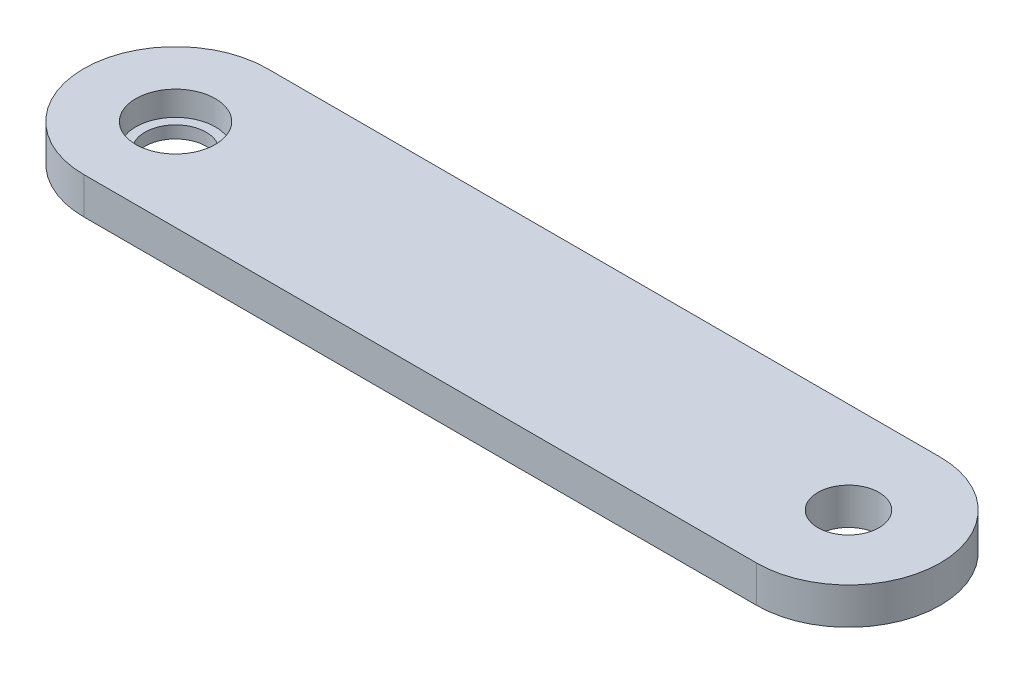
ISO-10303-21;
HEADER;
FILE_DESCRIPTION(('STEP AP214'),'2;1');
FILE_NAME('part.step','',(''),(''),'','','');
FILE_SCHEMA(('AUTOMOTIVE_DESIGN { 1 0 10303 214 1 1 1 1 }'));
ENDSEC;
DATA;
#1=APPLICATION_CONTEXT('core data for automotive mechanical design processes');
#2=APPLICATION_PROTOCOL_DEFINITION('international standard','automotive_design',2000,#1);
#3=PRODUCT_CONTEXT('',#1,'mechanical');
#4=PRODUCT('Part','Part','',(#3));
#5=PRODUCT_RELATED_PRODUCT_CATEGORY('part','',(#4));
#6=PRODUCT_DEFINITION_FORMATION('','',#4);
#7=PRODUCT_DEFINITION_CONTEXT('part definition',#1,'design');
#8=PRODUCT_DEFINITION('design','',#6,#7);
#9=PRODUCT_DEFINITION_SHAPE('','',#8);
#10=(LENGTH_UNIT() NAMED_UNIT(*) SI_UNIT(.MILLI.,.METRE.));
#11=(NAMED_UNIT(*) PLANE_ANGLE_UNIT() SI_UNIT($,.RADIAN.));
#12=(NAMED_UNIT(*) SI_UNIT($,.STERADIAN.) SOLID_ANGLE_UNIT());
#13=UNCERTAINTY_MEASURE_WITH_UNIT(LENGTH_MEASURE(1.E-05),#10,'distance_accuracy_value','');
#14=(GEOMETRIC_REPRESENTATION_CONTEXT(3) GLOBAL_UNCERTAINTY_ASSIGNED_CONTEXT((#13)) GLOBAL_UNIT_ASSIGNED_CONTEXT((#10,
#11,#12)) REPRESENTATION_CONTEXT('',''));
#15=CARTESIAN_POINT('',(0.,0.,0.));
#16=DIRECTION('',(0.,0.,1.));
#17=DIRECTION('',(1.,0.,0.));
#18=AXIS2_PLACEMENT_3D('',#15,#16,#17);
#19=CARTESIAN_POINT('',(-45.,6.,0.));
#20=DIRECTION('',(0.,-1.,0.));
#21=DIRECTION('',(0.,0.,-1.));
#22=AXIS2_PLACEMENT_3D('',#19,#20,#21);
#23=CYLINDRICAL_SURFACE('',#22,5.);
#24=CARTESIAN_POINT('',(-45.,0.,0.));
#25=DIRECTION('',(0.,1.,0.));
#26=DIRECTION('',(0.,0.,1.));
#27=AXIS2_PLACEMENT_3D('',#24,#25,#26);
#28=CIRCLE('',#27,5.);
#29=CARTESIAN_POINT('',(-45.,0.,5.));
#30=VERTEX_POINT('',#29);
#31=EDGE_CURVE('E115',#30,#30,#28,.T.);
#32=ORIENTED_EDGE('',*,*,#31,.F.);
#33=EDGE_LOOP('',(#32));
#34=FACE_BOUND('',#33,.T.);
#35=CARTESIAN_POINT('',(-45.,2.,0.));
#36=DIRECTION('',(0.,1.,0.));
#37=DIRECTION('',(0.,0.,1.));
#38=AXIS2_PLACEMENT_3D('',#35,#36,#37);
#39=CIRCLE('',#38,5.);
#40=CARTESIAN_POINT('',(-45.,2.,5.));
#41=VERTEX_POINT('',#40);
#42=EDGE_CURVE('E43',#41,#41,#39,.T.);
#43=ORIENTED_EDGE('',*,*,#42,.T.);
#44=EDGE_LOOP('',(#43));
#45=FACE_BOUND('',#44,.T.);
#46=ADVANCED_FACE('F39',(#34,#45),#23,.F.);
#47=CARTESIAN_POINT('',(65.,6.,0.));
#48=DIRECTION('',(0.,1.,0.));
#49=DIRECTION('',(0.,0.,1.));
#50=AXIS2_PLACEMENT_3D('',#47,#48,#49);
#51=PLANE('',#50);
#52=CARTESIAN_POINT('',(-45.,6.,0.));
#53=DIRECTION('',(0.,1.,0.));
#54=DIRECTION('',(0.,0.,1.));
#55=AXIS2_PLACEMENT_3D('',#52,#53,#54);
#56=CIRCLE('',#55,6.5);
#57=CARTESIAN_POINT('',(-45.,6.,6.5));
#58=VERTEX_POINT('',#57);
#59=EDGE_CURVE('E144',#58,#58,#56,.T.);
#60=ORIENTED_EDGE('',*,*,#59,.F.);
#61=EDGE_LOOP('',(#60));
#62=FACE_BOUND('',#61,.T.);
#63=CARTESIAN_POINT('',(65.,6.,0.));
#64=DIRECTION('',(0.,1.,0.));
#65=DIRECTION('',(0.,0.,1.));
#66=AXIS2_PLACEMENT_3D('',#63,#64,#65);
#67=CIRCLE('',#66,15.);
#68=CARTESIAN_POINT('',(65.,6.,15.));
#69=VERTEX_POINT('',#68);
#70=CARTESIAN_POINT('',(65.,6.,-15.));
#71=VERTEX_POINT('',#70);
#72=EDGE_CURVE('E94',#69,#71,#67,.T.);
#73=ORIENTED_EDGE('',*,*,#72,.T.);
#74=DIRECTION('',(-1.,0.,0.));
#75=VECTOR('',#74,1.);
#76=CARTESIAN_POINT('',(-45.,6.,-15.));
#77=LINE('',#76,#75);
#78=CARTESIAN_POINT('',(-45.,6.,-15.));
#79=VERTEX_POINT('',#78);
#80=EDGE_CURVE('E88',#71,#79,#77,.T.);
#81=ORIENTED_EDGE('',*,*,#80,.T.);
#82=CARTESIAN_POINT('',(-45.,6.,0.));
#83=DIRECTION('',(0.,1.,0.));
#84=DIRECTION('',(0.,0.,1.));
#85=AXIS2_PLACEMENT_3D('',#82,#83,#84);
#86=CIRCLE('',#85,15.);
#87=CARTESIAN_POINT('',(-45.,6.,15.));
#88=VERTEX_POINT('',#87);
#89=EDGE_CURVE('E92',#79,#88,#86,.T.);
#90=ORIENTED_EDGE('',*,*,#89,.T.);
#91=DIRECTION('',(1.,0.,0.));
#92=VECTOR('',#91,1.);
#93=CARTESIAN_POINT('',(-45.,6.,15.));
#94=LINE('',#93,#92);
#95=EDGE_CURVE('E58',#88,#69,#94,.T.);
#96=ORIENTED_EDGE('',*,*,#95,.T.);
#97=EDGE_LOOP('',(#73,#81,#90,#96));
#98=FACE_BOUND('',#97,.T.);
#99=CARTESIAN_POINT('',(65.,6.,0.));
#100=DIRECTION('',(0.,1.,0.));
#101=DIRECTION('',(0.,0.,1.));
#102=AXIS2_PLACEMENT_3D('',#99,#100,#101);
#103=CIRCLE('',#102,5.);
#104=CARTESIAN_POINT('',(65.,6.,5.));
#105=VERTEX_POINT('',#104);
#106=EDGE_CURVE('E136',#105,#105,#103,.T.);
#107=ORIENTED_EDGE('',*,*,#106,.F.);
#108=EDGE_LOOP('',(#107));
#109=FACE_BOUND('',#108,.T.);
#110=ADVANCED_FACE('F89',(#62,#98,#109),#51,.T.);
#111=CARTESIAN_POINT('',(65.,0.,0.));
#112=DIRECTION('',(0.,1.,0.));
#113=DIRECTION('',(0.,0.,1.));
#114=AXIS2_PLACEMENT_3D('',#111,#112,#113);
#115=PLANE('',#114);
#116=CARTESIAN_POINT('',(65.,0.,0.));
#117=DIRECTION('',(0.,1.,0.));
#118=DIRECTION('',(0.,0.,1.));
#119=AXIS2_PLACEMENT_3D('',#116,#117,#118);
#120=CIRCLE('',#119,15.);
#121=CARTESIAN_POINT('',(65.,0.,15.));
#122=VERTEX_POINT('',#121);
#123=CARTESIAN_POINT('',(65.,0.,-15.));
#124=VERTEX_POINT('',#123);
#125=EDGE_CURVE('E111',#122,#124,#120,.T.);
#126=ORIENTED_EDGE('',*,*,#125,.F.);
#127=DIRECTION('',(1.,0.,0.));
#128=VECTOR('',#127,1.);
#129=CARTESIAN_POINT('',(-45.,0.,15.));
#130=LINE('',#129,#128);
#131=CARTESIAN_POINT('',(-45.,0.,15.));
#132=VERTEX_POINT('',#131);
#133=EDGE_CURVE('E81',#132,#122,#130,.T.);
#134=ORIENTED_EDGE('',*,*,#133,.F.);
#135=CARTESIAN_POINT('',(-45.,0.,0.));
#136=DIRECTION('',(0.,1.,0.));
#137=DIRECTION('',(0.,0.,1.));
#138=AXIS2_PLACEMENT_3D('',#135,#136,#137);
#139=CIRCLE('',#138,15.);
#140=CARTESIAN_POINT('',(-45.,0.,-15.));
#141=VERTEX_POINT('',#140);
#142=EDGE_CURVE('E75',#141,#132,#139,.T.);
#143=ORIENTED_EDGE('',*,*,#142,.F.);
#144=DIRECTION('',(-1.,0.,0.));
#145=VECTOR('',#144,1.);
#146=CARTESIAN_POINT('',(-45.,0.,-15.));
#147=LINE('',#146,#145);
#148=EDGE_CURVE('E99',#124,#141,#147,.T.);
#149=ORIENTED_EDGE('',*,*,#148,.F.);
#150=EDGE_LOOP('',(#126,#134,#143,#149));
#151=FACE_BOUND('',#150,.T.);
#152=ORIENTED_EDGE('',*,*,#31,.T.);
#153=EDGE_LOOP('',(#152));
#154=FACE_BOUND('',#153,.T.);
#155=CARTESIAN_POINT('',(65.,0.,0.));
#156=DIRECTION('',(0.,1.,0.));
#157=DIRECTION('',(0.,0.,1.));
#158=AXIS2_PLACEMENT_3D('',#155,#156,#157);
#159=CIRCLE('',#158,5.);
#160=CARTESIAN_POINT('',(65.,0.,5.));
#161=VERTEX_POINT('',#160);
#162=EDGE_CURVE('E137',#161,#161,#159,.T.);
#163=ORIENTED_EDGE('',*,*,#162,.T.);
#164=EDGE_LOOP('',(#163));
#165=FACE_BOUND('',#164,.T.);
#166=ADVANCED_FACE('F128',(#151,#154,#165),#115,.F.);
#167=CARTESIAN_POINT('',(65.,6.,0.));
#168=DIRECTION('',(0.,-1.,0.));
#169=DIRECTION('',(0.,0.,-1.));
#170=AXIS2_PLACEMENT_3D('',#167,#168,#169);
#171=CYLINDRICAL_SURFACE('',#170,15.);
#172=ORIENTED_EDGE('',*,*,#125,.T.);
#173=DIRECTION('',(0.,-1.,0.));
#174=VECTOR('',#173,1.);
#175=CARTESIAN_POINT('',(65.,6.,-15.));
#176=LINE('',#175,#174);
#177=EDGE_CURVE('E11',#71,#124,#176,.T.);
#178=ORIENTED_EDGE('',*,*,#177,.F.);
#179=ORIENTED_EDGE('',*,*,#72,.F.);
#180=DIRECTION('',(0.,-1.,0.));
#181=VECTOR('',#180,1.);
#182=CARTESIAN_POINT('',(65.,6.,15.));
#183=LINE('',#182,#181);
#184=EDGE_CURVE('E107',#69,#122,#183,.T.);
#185=ORIENTED_EDGE('',*,*,#184,.T.);
#186=EDGE_LOOP('',(#172,#178,#179,#185));
#187=FACE_BOUND('',#186,.T.);
#188=ADVANCED_FACE('F41',(#187),#171,.T.);
#189=CARTESIAN_POINT('',(-45.,6.,-15.));
#190=DIRECTION('',(0.,0.,1.));
#191=DIRECTION('',(1.,0.,0.));
#192=AXIS2_PLACEMENT_3D('',#189,#190,#191);
#193=PLANE('',#192);
#194=ORIENTED_EDGE('',*,*,#148,.T.);
#195=DIRECTION('',(0.,-1.,0.));
#196=VECTOR('',#195,1.);
#197=CARTESIAN_POINT('',(-45.,6.,-15.));
#198=LINE('',#197,#196);
#199=EDGE_CURVE('E50',#79,#141,#198,.T.);
#200=ORIENTED_EDGE('',*,*,#199,.F.);
#201=ORIENTED_EDGE('',*,*,#80,.F.);
#202=ORIENTED_EDGE('',*,*,#177,.T.);
#203=EDGE_LOOP('',(#194,#200,#201,#202));
#204=FACE_BOUND('',#203,.T.);
#205=ADVANCED_FACE('F98',(#204),#193,.F.);
#206=CARTESIAN_POINT('',(-45.,6.,0.));
#207=DIRECTION('',(0.,-1.,0.));
#208=DIRECTION('',(0.,0.,-1.));
#209=AXIS2_PLACEMENT_3D('',#206,#207,#208);
#210=CYLINDRICAL_SURFACE('',#209,15.);
#211=ORIENTED_EDGE('',*,*,#142,.T.);
#212=DIRECTION('',(0.,-1.,0.));
#213=VECTOR('',#212,1.);
#214=CARTESIAN_POINT('',(-45.,6.,15.));
#215=LINE('',#214,#213);
#216=EDGE_CURVE('E101',#88,#132,#215,.T.);
#217=ORIENTED_EDGE('',*,*,#216,.F.);
#218=ORIENTED_EDGE('',*,*,#89,.F.);
#219=ORIENTED_EDGE('',*,*,#199,.T.);
#220=EDGE_LOOP('',(#211,#217,#218,#219));
#221=FACE_BOUND('',#220,.T.);
#222=ADVANCED_FACE('F103',(#221),#210,.T.);
#223=CARTESIAN_POINT('',(-45.,6.,15.));
#224=DIRECTION('',(0.,0.,-1.));
#225=DIRECTION('',(-1.,0.,0.));
#226=AXIS2_PLACEMENT_3D('',#223,#224,#225);
#227=PLANE('',#226);
#228=ORIENTED_EDGE('',*,*,#133,.T.);
#229=ORIENTED_EDGE('',*,*,#184,.F.);
#230=ORIENTED_EDGE('',*,*,#95,.F.);
#231=ORIENTED_EDGE('',*,*,#216,.T.);
#232=EDGE_LOOP('',(#228,#229,#230,#231));
#233=FACE_BOUND('',#232,.T.);
#234=ADVANCED_FACE('F125',(#233),#227,.F.);
#235=CARTESIAN_POINT('',(65.,6.,0.));
#236=DIRECTION('',(0.,-1.,0.));
#237=DIRECTION('',(0.,0.,-1.));
#238=AXIS2_PLACEMENT_3D('',#235,#236,#237);
#239=CYLINDRICAL_SURFACE('',#238,5.);
#240=ORIENTED_EDGE('',*,*,#106,.T.);
#241=EDGE_LOOP('',(#240));
#242=FACE_BOUND('',#241,.T.);
#243=ORIENTED_EDGE('',*,*,#162,.F.);
#244=EDGE_LOOP('',(#243));
#245=FACE_BOUND('',#244,.T.);
#246=ADVANCED_FACE('F165',(#242,#245),#239,.F.);
#247=CARTESIAN_POINT('',(-45.,2.,0.));
#248=DIRECTION('',(0.,1.,0.));
#249=DIRECTION('',(0.,0.,1.));
#250=AXIS2_PLACEMENT_3D('',#247,#248,#249);
#251=CYLINDRICAL_SURFACE('',#250,6.5);
#252=CARTESIAN_POINT('',(-45.,2.,0.));
#253=DIRECTION('',(0.,1.,0.));
#254=DIRECTION('',(0.,0.,1.));
#255=AXIS2_PLACEMENT_3D('',#252,#253,#254);
#256=CIRCLE('',#255,6.5);
#257=CARTESIAN_POINT('',(-45.,2.,6.5));
#258=VERTEX_POINT('',#257);
#259=EDGE_CURVE('E148',#258,#258,#256,.T.);
#260=ORIENTED_EDGE('',*,*,#259,.F.);
#261=EDGE_LOOP('',(#260));
#262=FACE_BOUND('',#261,.T.);
#263=ORIENTED_EDGE('',*,*,#59,.T.);
#264=EDGE_LOOP('',(#263));
#265=FACE_BOUND('',#264,.T.);
#266=ADVANCED_FACE('F160',(#262,#265),#251,.F.);
#267=CARTESIAN_POINT('',(-45.,2.,0.));
#268=DIRECTION('',(0.,1.,0.));
#269=DIRECTION('',(0.,0.,1.));
#270=AXIS2_PLACEMENT_3D('',#267,#268,#269);
#271=PLANE('',#270);
#272=ORIENTED_EDGE('',*,*,#42,.F.);
#273=EDGE_LOOP('',(#272));
#274=FACE_BOUND('',#273,.T.);
#275=ORIENTED_EDGE('',*,*,#259,.T.);
#276=EDGE_LOOP('',(#275));
#277=FACE_BOUND('',#276,.T.);
#278=ADVANCED_FACE('F158',(#274,#277),#271,.T.);
#279=CLOSED_SHELL('',(#46,#110,#166,#188,#205,#222,#234,#246,#266,#278));
#280=MANIFOLD_SOLID_BREP('B2',#279);
#281=ADVANCED_BREP_SHAPE_REPRESENTATION('',(#18,#280),#14);
#282=SHAPE_DEFINITION_REPRESENTATION(#9,#281);
ENDSEC;
END-ISO-10303-21;
